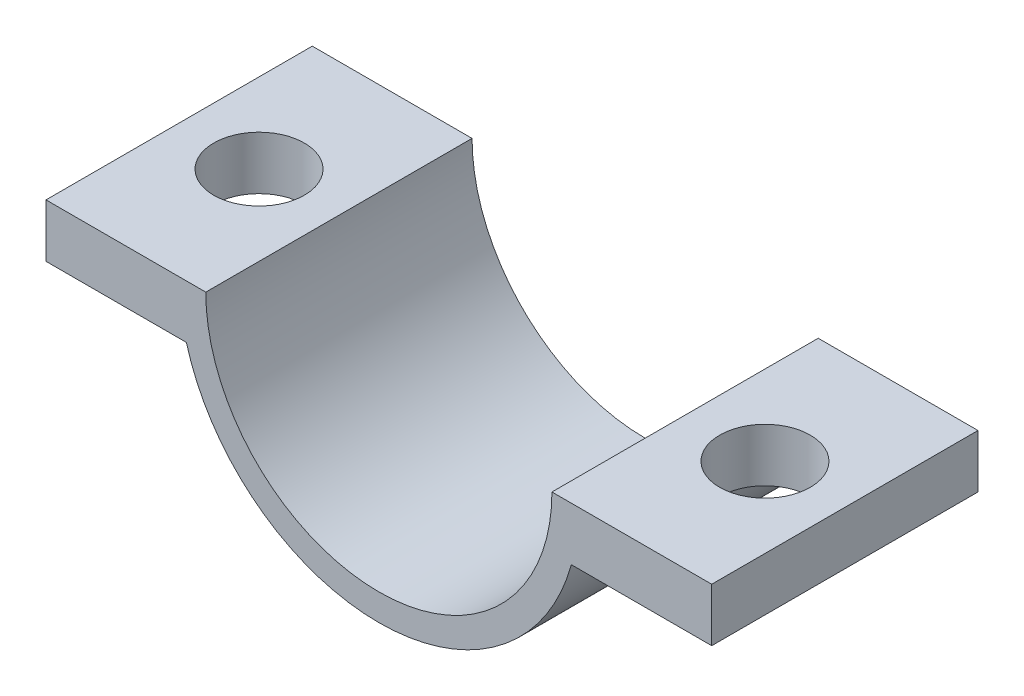
ISO-10303-21;
HEADER;
FILE_DESCRIPTION(('STEP AP214'),'2;1');
FILE_NAME('part.step','',(''),(''),'','','');
FILE_SCHEMA(('AUTOMOTIVE_DESIGN { 1 0 10303 214 1 1 1 1 }'));
ENDSEC;
DATA;
#1=APPLICATION_CONTEXT('core data for automotive mechanical design processes');
#2=APPLICATION_PROTOCOL_DEFINITION('international standard','automotive_design',2000,#1);
#3=PRODUCT_CONTEXT('',#1,'mechanical');
#4=PRODUCT('Part','Part','',(#3));
#5=PRODUCT_RELATED_PRODUCT_CATEGORY('part','',(#4));
#6=PRODUCT_DEFINITION_FORMATION('','',#4);
#7=PRODUCT_DEFINITION_CONTEXT('part definition',#1,'design');
#8=PRODUCT_DEFINITION('design','',#6,#7);
#9=PRODUCT_DEFINITION_SHAPE('','',#8);
#10=(LENGTH_UNIT() NAMED_UNIT(*) SI_UNIT(.MILLI.,.METRE.));
#11=(NAMED_UNIT(*) PLANE_ANGLE_UNIT() SI_UNIT($,.RADIAN.));
#12=(NAMED_UNIT(*) SI_UNIT($,.STERADIAN.) SOLID_ANGLE_UNIT());
#13=UNCERTAINTY_MEASURE_WITH_UNIT(LENGTH_MEASURE(1.E-05),#10,'distance_accuracy_value','');
#14=(GEOMETRIC_REPRESENTATION_CONTEXT(3) GLOBAL_UNCERTAINTY_ASSIGNED_CONTEXT((#13)) GLOBAL_UNIT_ASSIGNED_CONTEXT((#10,
#11,#12)) REPRESENTATION_CONTEXT('',''));
#15=CARTESIAN_POINT('',(0.,0.,0.));
#16=DIRECTION('',(0.,0.,1.));
#17=DIRECTION('',(1.,0.,0.));
#18=AXIS2_PLACEMENT_3D('',#15,#16,#17);
#19=CARTESIAN_POINT('',(12.5,-2.,10.));
#20=DIRECTION('',(0.,1.,0.));
#21=DIRECTION('',(0.,0.,1.));
#22=AXIS2_PLACEMENT_3D('',#19,#20,#21);
#23=PLANE('',#22);
#24=CARTESIAN_POINT('',(9.5,-2.,5.));
#25=DIRECTION('',(0.,1.,0.));
#26=DIRECTION('',(0.,0.,1.));
#27=AXIS2_PLACEMENT_3D('',#24,#25,#26);
#28=CIRCLE('',#27,1.7);
#29=CARTESIAN_POINT('',(9.5,-2.,6.7));
#30=VERTEX_POINT('',#29);
#31=EDGE_CURVE('E139',#30,#30,#28,.T.);
#32=ORIENTED_EDGE('',*,*,#31,.T.);
#33=EDGE_LOOP('',(#32));
#34=FACE_BOUND('',#33,.T.);
#35=DIRECTION('',(1.,0.,0.));
#36=VECTOR('',#35,1.);
#37=CARTESIAN_POINT('',(12.5,-2.,0.));
#38=LINE('',#37,#36);
#39=CARTESIAN_POINT('',(7.22841614740048,-2.,0.));
#40=VERTEX_POINT('',#39);
#41=CARTESIAN_POINT('',(12.5,-2.,0.));
#42=VERTEX_POINT('',#41);
#43=EDGE_CURVE('E136',#40,#42,#38,.T.);
#44=ORIENTED_EDGE('',*,*,#43,.T.);
#45=DIRECTION('',(0.,0.,-1.));
#46=VECTOR('',#45,1.);
#47=CARTESIAN_POINT('',(12.5,-2.,10.));
#48=LINE('',#47,#46);
#49=CARTESIAN_POINT('',(12.5,-2.,10.));
#50=VERTEX_POINT('',#49);
#51=EDGE_CURVE('E44',#50,#42,#48,.T.);
#52=ORIENTED_EDGE('',*,*,#51,.F.);
#53=DIRECTION('',(1.,0.,0.));
#54=VECTOR('',#53,1.);
#55=CARTESIAN_POINT('',(12.5,-2.,10.));
#56=LINE('',#55,#54);
#57=CARTESIAN_POINT('',(7.22841614740048,-2.,10.));
#58=VERTEX_POINT('',#57);
#59=EDGE_CURVE('E96',#58,#50,#56,.T.);
#60=ORIENTED_EDGE('',*,*,#59,.F.);
#61=DIRECTION('',(0.,0.,-1.));
#62=VECTOR('',#61,1.);
#63=CARTESIAN_POINT('',(7.22841614740048,-2.,10.));
#64=LINE('',#63,#62);
#65=EDGE_CURVE('E11',#58,#40,#64,.T.);
#66=ORIENTED_EDGE('',*,*,#65,.T.);
#67=EDGE_LOOP('',(#44,#52,#60,#66));
#68=FACE_BOUND('',#67,.T.);
#69=ADVANCED_FACE('F35',(#34,#68),#23,.F.);
#70=CARTESIAN_POINT('',(12.5,0.,10.));
#71=DIRECTION('',(-1.,0.,0.));
#72=DIRECTION('',(0.,-1.,0.));
#73=AXIS2_PLACEMENT_3D('',#70,#71,#72);
#74=PLANE('',#73);
#75=DIRECTION('',(0.,1.,0.));
#76=VECTOR('',#75,1.);
#77=CARTESIAN_POINT('',(12.5,0.,0.));
#78=LINE('',#77,#76);
#79=CARTESIAN_POINT('',(12.5,0.,0.));
#80=VERTEX_POINT('',#79);
#81=EDGE_CURVE('E138',#42,#80,#78,.T.);
#82=ORIENTED_EDGE('',*,*,#81,.T.);
#83=DIRECTION('',(0.,0.,-1.));
#84=VECTOR('',#83,1.);
#85=CARTESIAN_POINT('',(12.5,0.,10.));
#86=LINE('',#85,#84);
#87=CARTESIAN_POINT('',(12.5,0.,10.));
#88=VERTEX_POINT('',#87);
#89=EDGE_CURVE('E156',#88,#80,#86,.T.);
#90=ORIENTED_EDGE('',*,*,#89,.F.);
#91=DIRECTION('',(0.,1.,0.));
#92=VECTOR('',#91,1.);
#93=CARTESIAN_POINT('',(12.5,0.,10.));
#94=LINE('',#93,#92);
#95=EDGE_CURVE('E165',#50,#88,#94,.T.);
#96=ORIENTED_EDGE('',*,*,#95,.F.);
#97=ORIENTED_EDGE('',*,*,#51,.T.);
#98=EDGE_LOOP('',(#82,#90,#96,#97));
#99=FACE_BOUND('',#98,.T.);
#100=ADVANCED_FACE('F163',(#99),#74,.F.);
#101=CARTESIAN_POINT('',(6.5,0.,10.));
#102=DIRECTION('',(0.,-1.,0.));
#103=DIRECTION('',(0.,0.,-1.));
#104=AXIS2_PLACEMENT_3D('',#101,#102,#103);
#105=PLANE('',#104);
#106=CARTESIAN_POINT('',(9.5,0.,5.));
#107=DIRECTION('',(0.,1.,0.));
#108=DIRECTION('',(0.,0.,1.));
#109=AXIS2_PLACEMENT_3D('',#106,#107,#108);
#110=CIRCLE('',#109,1.7);
#111=CARTESIAN_POINT('',(9.5,0.,6.7));
#112=VERTEX_POINT('',#111);
#113=EDGE_CURVE('E186',#112,#112,#110,.T.);
#114=ORIENTED_EDGE('',*,*,#113,.F.);
#115=EDGE_LOOP('',(#114));
#116=FACE_BOUND('',#115,.T.);
#117=DIRECTION('',(-1.,0.,0.));
#118=VECTOR('',#117,1.);
#119=CARTESIAN_POINT('',(6.5,0.,0.));
#120=LINE('',#119,#118);
#121=CARTESIAN_POINT('',(6.5,0.,0.));
#122=VERTEX_POINT('',#121);
#123=EDGE_CURVE('E141',#80,#122,#120,.T.);
#124=ORIENTED_EDGE('',*,*,#123,.T.);
#125=DIRECTION('',(0.,0.,-1.));
#126=VECTOR('',#125,1.);
#127=CARTESIAN_POINT('',(6.5,0.,10.));
#128=LINE('',#127,#126);
#129=CARTESIAN_POINT('',(6.5,0.,10.));
#130=VERTEX_POINT('',#129);
#131=EDGE_CURVE('E153',#130,#122,#128,.T.);
#132=ORIENTED_EDGE('',*,*,#131,.F.);
#133=DIRECTION('',(-1.,0.,0.));
#134=VECTOR('',#133,1.);
#135=CARTESIAN_POINT('',(6.5,0.,10.));
#136=LINE('',#135,#134);
#137=EDGE_CURVE('E178',#88,#130,#136,.T.);
#138=ORIENTED_EDGE('',*,*,#137,.F.);
#139=ORIENTED_EDGE('',*,*,#89,.T.);
#140=EDGE_LOOP('',(#124,#132,#138,#139));
#141=FACE_BOUND('',#140,.T.);
#142=ADVANCED_FACE('F174',(#116,#141),#105,.F.);
#143=CARTESIAN_POINT('',(0.,0.,10.));
#144=DIRECTION('',(0.,0.,-1.));
#145=DIRECTION('',(-1.,0.,0.));
#146=AXIS2_PLACEMENT_3D('',#143,#144,#145);
#147=CYLINDRICAL_SURFACE('',#146,6.5);
#148=CARTESIAN_POINT('',(0.,0.,0.));
#149=DIRECTION('',(0.,0.,-1.));
#150=DIRECTION('',(1.,0.,0.));
#151=AXIS2_PLACEMENT_3D('',#148,#149,#150);
#152=CIRCLE('',#151,6.5);
#153=CARTESIAN_POINT('',(-6.5,0.,0.));
#154=VERTEX_POINT('',#153);
#155=EDGE_CURVE('E143',#122,#154,#152,.T.);
#156=ORIENTED_EDGE('',*,*,#155,.T.);
#157=DIRECTION('',(0.,0.,-1.));
#158=VECTOR('',#157,1.);
#159=CARTESIAN_POINT('',(-6.5,0.,10.));
#160=LINE('',#159,#158);
#161=CARTESIAN_POINT('',(-6.5,0.,10.));
#162=VERTEX_POINT('',#161);
#163=EDGE_CURVE('E125',#162,#154,#160,.T.);
#164=ORIENTED_EDGE('',*,*,#163,.F.);
#165=CARTESIAN_POINT('',(0.,0.,10.));
#166=DIRECTION('',(0.,0.,-1.));
#167=DIRECTION('',(1.,0.,0.));
#168=AXIS2_PLACEMENT_3D('',#165,#166,#167);
#169=CIRCLE('',#168,6.5);
#170=EDGE_CURVE('E116',#130,#162,#169,.T.);
#171=ORIENTED_EDGE('',*,*,#170,.F.);
#172=ORIENTED_EDGE('',*,*,#131,.T.);
#173=EDGE_LOOP('',(#156,#164,#171,#172));
#174=FACE_BOUND('',#173,.T.);
#175=ADVANCED_FACE('F177',(#174),#147,.F.);
#176=CARTESIAN_POINT('',(-6.5,0.,10.));
#177=DIRECTION('',(0.,-1.,0.));
#178=DIRECTION('',(0.,0.,-1.));
#179=AXIS2_PLACEMENT_3D('',#176,#177,#178);
#180=PLANE('',#179);
#181=CARTESIAN_POINT('',(-9.5,0.,5.));
#182=DIRECTION('',(0.,1.,0.));
#183=DIRECTION('',(0.,0.,1.));
#184=AXIS2_PLACEMENT_3D('',#181,#182,#183);
#185=CIRCLE('',#184,1.7);
#186=CARTESIAN_POINT('',(-9.5,0.,6.7));
#187=VERTEX_POINT('',#186);
#188=EDGE_CURVE('E189',#187,#187,#185,.T.);
#189=ORIENTED_EDGE('',*,*,#188,.F.);
#190=EDGE_LOOP('',(#189));
#191=FACE_BOUND('',#190,.T.);
#192=DIRECTION('',(-1.,0.,0.));
#193=VECTOR('',#192,1.);
#194=CARTESIAN_POINT('',(-6.5,0.,0.));
#195=LINE('',#194,#193);
#196=CARTESIAN_POINT('',(-12.5,0.,0.));
#197=VERTEX_POINT('',#196);
#198=EDGE_CURVE('E124',#154,#197,#195,.T.);
#199=ORIENTED_EDGE('',*,*,#198,.T.);
#200=DIRECTION('',(0.,0.,-1.));
#201=VECTOR('',#200,1.);
#202=CARTESIAN_POINT('',(-12.5,0.,10.));
#203=LINE('',#202,#201);
#204=CARTESIAN_POINT('',(-12.5,0.,10.));
#205=VERTEX_POINT('',#204);
#206=EDGE_CURVE('E121',#205,#197,#203,.T.);
#207=ORIENTED_EDGE('',*,*,#206,.F.);
#208=DIRECTION('',(-1.,0.,0.));
#209=VECTOR('',#208,1.);
#210=CARTESIAN_POINT('',(-6.5,0.,10.));
#211=LINE('',#210,#209);
#212=EDGE_CURVE('E110',#162,#205,#211,.T.);
#213=ORIENTED_EDGE('',*,*,#212,.F.);
#214=ORIENTED_EDGE('',*,*,#163,.T.);
#215=EDGE_LOOP('',(#199,#207,#213,#214));
#216=FACE_BOUND('',#215,.T.);
#217=ADVANCED_FACE('F122',(#191,#216),#180,.F.);
#218=CARTESIAN_POINT('',(-12.5,0.,10.));
#219=DIRECTION('',(1.,0.,0.));
#220=DIRECTION('',(0.,1.,0.));
#221=AXIS2_PLACEMENT_3D('',#218,#219,#220);
#222=PLANE('',#221);
#223=DIRECTION('',(0.,-1.,0.));
#224=VECTOR('',#223,1.);
#225=CARTESIAN_POINT('',(-12.5,0.,0.));
#226=LINE('',#225,#224);
#227=CARTESIAN_POINT('',(-12.5,-2.,0.));
#228=VERTEX_POINT('',#227);
#229=EDGE_CURVE('E82',#197,#228,#226,.T.);
#230=ORIENTED_EDGE('',*,*,#229,.T.);
#231=DIRECTION('',(0.,0.,-1.));
#232=VECTOR('',#231,1.);
#233=CARTESIAN_POINT('',(-12.5,-2.,10.));
#234=LINE('',#233,#232);
#235=CARTESIAN_POINT('',(-12.5,-2.,10.));
#236=VERTEX_POINT('',#235);
#237=EDGE_CURVE('E126',#236,#228,#234,.T.);
#238=ORIENTED_EDGE('',*,*,#237,.F.);
#239=DIRECTION('',(0.,-1.,0.));
#240=VECTOR('',#239,1.);
#241=CARTESIAN_POINT('',(-12.5,0.,10.));
#242=LINE('',#241,#240);
#243=EDGE_CURVE('E114',#205,#236,#242,.T.);
#244=ORIENTED_EDGE('',*,*,#243,.F.);
#245=ORIENTED_EDGE('',*,*,#206,.T.);
#246=EDGE_LOOP('',(#230,#238,#244,#245));
#247=FACE_BOUND('',#246,.T.);
#248=ADVANCED_FACE('F128',(#247),#222,.F.);
#249=CARTESIAN_POINT('',(-12.5,-2.,10.));
#250=DIRECTION('',(0.,1.,0.));
#251=DIRECTION('',(0.,0.,1.));
#252=AXIS2_PLACEMENT_3D('',#249,#250,#251);
#253=PLANE('',#252);
#254=CARTESIAN_POINT('',(-9.5,-2.,5.));
#255=DIRECTION('',(0.,1.,0.));
#256=DIRECTION('',(0.,0.,1.));
#257=AXIS2_PLACEMENT_3D('',#254,#255,#256);
#258=CIRCLE('',#257,1.7);
#259=CARTESIAN_POINT('',(-9.5,-2.,6.7));
#260=VERTEX_POINT('',#259);
#261=EDGE_CURVE('E38',#260,#260,#258,.T.);
#262=ORIENTED_EDGE('',*,*,#261,.T.);
#263=EDGE_LOOP('',(#262));
#264=FACE_BOUND('',#263,.T.);
#265=DIRECTION('',(1.,0.,0.));
#266=VECTOR('',#265,1.);
#267=CARTESIAN_POINT('',(-12.5,-2.,0.));
#268=LINE('',#267,#266);
#269=CARTESIAN_POINT('',(-7.22841614740048,-2.,0.));
#270=VERTEX_POINT('',#269);
#271=EDGE_CURVE('E89',#228,#270,#268,.T.);
#272=ORIENTED_EDGE('',*,*,#271,.T.);
#273=DIRECTION('',(0.,0.,-1.));
#274=VECTOR('',#273,1.);
#275=CARTESIAN_POINT('',(-7.22841614740048,-2.,10.));
#276=LINE('',#275,#274);
#277=CARTESIAN_POINT('',(-7.22841614740048,-2.,10.));
#278=VERTEX_POINT('',#277);
#279=EDGE_CURVE('E132',#278,#270,#276,.T.);
#280=ORIENTED_EDGE('',*,*,#279,.F.);
#281=DIRECTION('',(1.,0.,0.));
#282=VECTOR('',#281,1.);
#283=CARTESIAN_POINT('',(-12.5,-2.,10.));
#284=LINE('',#283,#282);
#285=EDGE_CURVE('E130',#236,#278,#284,.T.);
#286=ORIENTED_EDGE('',*,*,#285,.F.);
#287=ORIENTED_EDGE('',*,*,#237,.T.);
#288=EDGE_LOOP('',(#272,#280,#286,#287));
#289=FACE_BOUND('',#288,.T.);
#290=ADVANCED_FACE('F196',(#264,#289),#253,.F.);
#291=CARTESIAN_POINT('',(0.,0.,10.));
#292=DIRECTION('',(0.,0.,-1.));
#293=DIRECTION('',(-1.,0.,0.));
#294=AXIS2_PLACEMENT_3D('',#291,#292,#293);
#295=CYLINDRICAL_SURFACE('',#294,7.5);
#296=CARTESIAN_POINT('',(0.,0.,0.));
#297=DIRECTION('',(0.,0.,1.));
#298=DIRECTION('',(1.,0.,0.));
#299=AXIS2_PLACEMENT_3D('',#296,#297,#298);
#300=CIRCLE('',#299,7.5);
#301=EDGE_CURVE('E148',#270,#40,#300,.T.);
#302=ORIENTED_EDGE('',*,*,#301,.T.);
#303=ORIENTED_EDGE('',*,*,#65,.F.);
#304=CARTESIAN_POINT('',(0.,0.,10.));
#305=DIRECTION('',(0.,0.,1.));
#306=DIRECTION('',(-1.,0.,0.));
#307=AXIS2_PLACEMENT_3D('',#304,#305,#306);
#308=CIRCLE('',#307,7.5);
#309=EDGE_CURVE('E52',#278,#58,#308,.T.);
#310=ORIENTED_EDGE('',*,*,#309,.F.);
#311=ORIENTED_EDGE('',*,*,#279,.T.);
#312=EDGE_LOOP('',(#302,#303,#310,#311));
#313=FACE_BOUND('',#312,.T.);
#314=ADVANCED_FACE('F215',(#313),#295,.T.);
#315=CARTESIAN_POINT('',(0.,0.,10.));
#316=DIRECTION('',(0.,0.,-1.));
#317=DIRECTION('',(-1.,0.,0.));
#318=AXIS2_PLACEMENT_3D('',#315,#316,#317);
#319=PLANE('',#318);
#320=ORIENTED_EDGE('',*,*,#309,.T.);
#321=ORIENTED_EDGE('',*,*,#59,.T.);
#322=ORIENTED_EDGE('',*,*,#95,.T.);
#323=ORIENTED_EDGE('',*,*,#137,.T.);
#324=ORIENTED_EDGE('',*,*,#170,.T.);
#325=ORIENTED_EDGE('',*,*,#212,.T.);
#326=ORIENTED_EDGE('',*,*,#243,.T.);
#327=ORIENTED_EDGE('',*,*,#285,.T.);
#328=EDGE_LOOP('',(#320,#321,#322,#323,#324,#325,#326,#327));
#329=FACE_BOUND('',#328,.T.);
#330=ADVANCED_FACE('F112',(#329),#319,.F.);
#331=CARTESIAN_POINT('',(0.,0.,0.));
#332=DIRECTION('',(0.,0.,-1.));
#333=DIRECTION('',(-1.,0.,0.));
#334=AXIS2_PLACEMENT_3D('',#331,#332,#333);
#335=PLANE('',#334);
#336=ORIENTED_EDGE('',*,*,#43,.F.);
#337=ORIENTED_EDGE('',*,*,#301,.F.);
#338=ORIENTED_EDGE('',*,*,#271,.F.);
#339=ORIENTED_EDGE('',*,*,#229,.F.);
#340=ORIENTED_EDGE('',*,*,#198,.F.);
#341=ORIENTED_EDGE('',*,*,#155,.F.);
#342=ORIENTED_EDGE('',*,*,#123,.F.);
#343=ORIENTED_EDGE('',*,*,#81,.F.);
#344=EDGE_LOOP('',(#336,#337,#338,#339,#340,#341,#342,#343));
#345=FACE_BOUND('',#344,.T.);
#346=ADVANCED_FACE('F169',(#345),#335,.T.);
#347=CARTESIAN_POINT('',(-9.5,-10.,5.));
#348=DIRECTION('',(0.,1.,0.));
#349=DIRECTION('',(0.,0.,1.));
#350=AXIS2_PLACEMENT_3D('',#347,#348,#349);
#351=CYLINDRICAL_SURFACE('',#350,1.7);
#352=ORIENTED_EDGE('',*,*,#188,.T.);
#353=EDGE_LOOP('',(#352));
#354=FACE_BOUND('',#353,.T.);
#355=ORIENTED_EDGE('',*,*,#261,.F.);
#356=EDGE_LOOP('',(#355));
#357=FACE_BOUND('',#356,.T.);
#358=ADVANCED_FACE('F198',(#354,#357),#351,.F.);
#359=CARTESIAN_POINT('',(9.5,-10.,5.));
#360=DIRECTION('',(0.,1.,0.));
#361=DIRECTION('',(0.,0.,1.));
#362=AXIS2_PLACEMENT_3D('',#359,#360,#361);
#363=CYLINDRICAL_SURFACE('',#362,1.7);
#364=ORIENTED_EDGE('',*,*,#113,.T.);
#365=EDGE_LOOP('',(#364));
#366=FACE_BOUND('',#365,.T.);
#367=ORIENTED_EDGE('',*,*,#31,.F.);
#368=EDGE_LOOP('',(#367));
#369=FACE_BOUND('',#368,.T.);
#370=ADVANCED_FACE('F200',(#366,#369),#363,.F.);
#371=CLOSED_SHELL('',(#69,#100,#142,#175,#217,#248,#290,#314,#330,#346,#358,#370));
#372=MANIFOLD_SOLID_BREP('B2',#371);
#373=ADVANCED_BREP_SHAPE_REPRESENTATION('',(#18,#372),#14);
#374=SHAPE_DEFINITION_REPRESENTATION(#9,#373);
ENDSEC;
END-ISO-10303-21;
